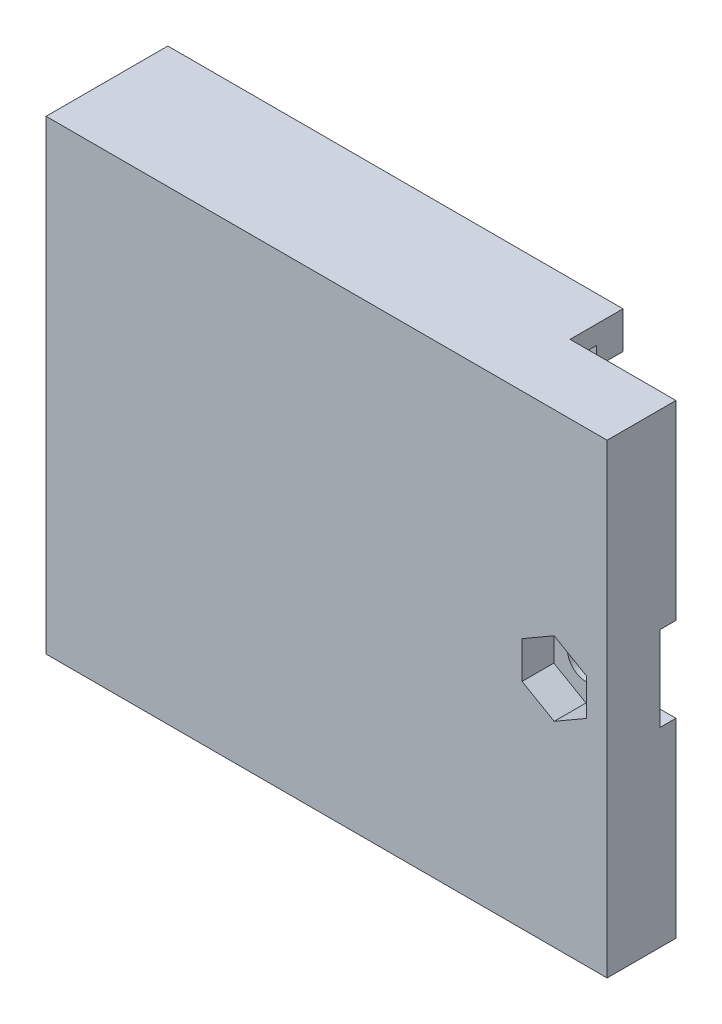
ISO-10303-21;
HEADER;
FILE_DESCRIPTION(('STEP AP214'),'2;1');
FILE_NAME('part.step','',(''),(''),'','','');
FILE_SCHEMA(('AUTOMOTIVE_DESIGN { 1 0 10303 214 1 1 1 1 }'));
ENDSEC;
DATA;
#1=APPLICATION_CONTEXT('core data for automotive mechanical design processes');
#2=APPLICATION_PROTOCOL_DEFINITION('international standard','automotive_design',2000,#1);
#3=PRODUCT_CONTEXT('',#1,'mechanical');
#4=PRODUCT('Part','Part','',(#3));
#5=PRODUCT_RELATED_PRODUCT_CATEGORY('part','',(#4));
#6=PRODUCT_DEFINITION_FORMATION('','',#4);
#7=PRODUCT_DEFINITION_CONTEXT('part definition',#1,'design');
#8=PRODUCT_DEFINITION('design','',#6,#7);
#9=PRODUCT_DEFINITION_SHAPE('','',#8);
#10=(LENGTH_UNIT() NAMED_UNIT(*) SI_UNIT(.MILLI.,.METRE.));
#11=(NAMED_UNIT(*) PLANE_ANGLE_UNIT() SI_UNIT($,.RADIAN.));
#12=(NAMED_UNIT(*) SI_UNIT($,.STERADIAN.) SOLID_ANGLE_UNIT());
#13=UNCERTAINTY_MEASURE_WITH_UNIT(LENGTH_MEASURE(1.E-05),#10,'distance_accuracy_value','');
#14=(GEOMETRIC_REPRESENTATION_CONTEXT(3) GLOBAL_UNCERTAINTY_ASSIGNED_CONTEXT((#13)) GLOBAL_UNIT_ASSIGNED_CONTEXT((#10,
#11,#12)) REPRESENTATION_CONTEXT('',''));
#15=CARTESIAN_POINT('',(0.,0.,0.));
#16=DIRECTION('',(0.,0.,1.));
#17=DIRECTION('',(1.,0.,0.));
#18=AXIS2_PLACEMENT_3D('',#15,#16,#17);
#19=CARTESIAN_POINT('',(21.5,0.,6.5));
#20=DIRECTION('',(0.,0.,-1.));
#21=DIRECTION('',(-1.,0.,0.));
#22=AXIS2_PLACEMENT_3D('',#19,#20,#21);
#23=CYLINDRICAL_SURFACE('',#22,1.75);
#24=CARTESIAN_POINT('',(21.5,0.,1.5));
#25=DIRECTION('',(0.,0.,1.));
#26=DIRECTION('',(1.,0.,0.));
#27=AXIS2_PLACEMENT_3D('',#24,#25,#26);
#28=CIRCLE('',#27,1.75);
#29=CARTESIAN_POINT('',(19.75,0.,1.5));
#30=VERTEX_POINT('',#29);
#31=EDGE_CURVE('E327',#30,#30,#28,.T.);
#32=CARTESIAN_POINT('',(21.5,0.,3.5));
#33=DIRECTION('',(0.,0.,1.));
#34=DIRECTION('',(1.,0.,0.));
#35=AXIS2_PLACEMENT_3D('',#32,#33,#34);
#36=CIRCLE('',#35,1.75);
#37=CARTESIAN_POINT('',(19.75,0.,3.5));
#38=VERTEX_POINT('',#37);
#39=EDGE_CURVE('E37',#38,#38,#36,.T.);
#40=CARTESIAN_POINT('',(19.75,0.,1.5));
#41=CARTESIAN_POINT('',(19.75,0.,1.52083333333333));
#42=CARTESIAN_POINT('',(19.75,0.,1.54166666666667));
#43=CARTESIAN_POINT('',(19.75,0.,1.58333333333333));
#44=CARTESIAN_POINT('',(19.75,0.,1.60416666666667));
#45=CARTESIAN_POINT('',(19.75,0.,1.64583333333333));
#46=CARTESIAN_POINT('',(19.75,0.,1.66666666666667));
#47=CARTESIAN_POINT('',(19.75,0.,1.70833333333333));
#48=CARTESIAN_POINT('',(19.75,0.,1.72916666666667));
#49=CARTESIAN_POINT('',(19.75,0.,1.77083333333333));
#50=CARTESIAN_POINT('',(19.75,0.,1.79166666666667));
#51=CARTESIAN_POINT('',(19.75,0.,1.83333333333333));
#52=CARTESIAN_POINT('',(19.75,0.,1.85416666666667));
#53=CARTESIAN_POINT('',(19.75,0.,1.89583333333333));
#54=CARTESIAN_POINT('',(19.75,0.,1.91666666666667));
#55=CARTESIAN_POINT('',(19.75,0.,1.95833333333333));
#56=CARTESIAN_POINT('',(19.75,0.,1.97916666666667));
#57=CARTESIAN_POINT('',(19.75,0.,2.02083333333333));
#58=CARTESIAN_POINT('',(19.75,0.,2.04166666666667));
#59=CARTESIAN_POINT('',(19.75,0.,2.08333333333333));
#60=CARTESIAN_POINT('',(19.75,0.,2.10416666666667));
#61=CARTESIAN_POINT('',(19.75,0.,2.14583333333333));
#62=CARTESIAN_POINT('',(19.75,0.,2.16666666666667));
#63=CARTESIAN_POINT('',(19.75,0.,2.20833333333333));
#64=CARTESIAN_POINT('',(19.75,0.,2.22916666666667));
#65=CARTESIAN_POINT('',(19.75,0.,2.27083333333333));
#66=CARTESIAN_POINT('',(19.75,0.,2.29166666666667));
#67=CARTESIAN_POINT('',(19.75,0.,2.33333333333333));
#68=CARTESIAN_POINT('',(19.75,0.,2.35416666666667));
#69=CARTESIAN_POINT('',(19.75,0.,2.39583333333333));
#70=CARTESIAN_POINT('',(19.75,0.,2.41666666666667));
#71=CARTESIAN_POINT('',(19.75,0.,2.45833333333333));
#72=CARTESIAN_POINT('',(19.75,0.,2.47916666666667));
#73=CARTESIAN_POINT('',(19.75,0.,2.52083333333333));
#74=CARTESIAN_POINT('',(19.75,0.,2.54166666666667));
#75=CARTESIAN_POINT('',(19.75,0.,2.58333333333333));
#76=CARTESIAN_POINT('',(19.75,0.,2.60416666666667));
#77=CARTESIAN_POINT('',(19.75,0.,2.64583333333333));
#78=CARTESIAN_POINT('',(19.75,0.,2.66666666666667));
#79=CARTESIAN_POINT('',(19.75,0.,2.70833333333333));
#80=CARTESIAN_POINT('',(19.75,0.,2.72916666666667));
#81=CARTESIAN_POINT('',(19.75,0.,2.77083333333333));
#82=CARTESIAN_POINT('',(19.75,0.,2.79166666666667));
#83=CARTESIAN_POINT('',(19.75,0.,2.83333333333333));
#84=CARTESIAN_POINT('',(19.75,0.,2.85416666666667));
#85=CARTESIAN_POINT('',(19.75,0.,2.89583333333333));
#86=CARTESIAN_POINT('',(19.75,0.,2.91666666666667));
#87=CARTESIAN_POINT('',(19.75,0.,2.95833333333333));
#88=CARTESIAN_POINT('',(19.75,0.,2.97916666666667));
#89=CARTESIAN_POINT('',(19.75,0.,3.02083333333333));
#90=CARTESIAN_POINT('',(19.75,0.,3.04166666666667));
#91=CARTESIAN_POINT('',(19.75,0.,3.08333333333333));
#92=CARTESIAN_POINT('',(19.75,0.,3.10416666666667));
#93=CARTESIAN_POINT('',(19.75,0.,3.14583333333333));
#94=CARTESIAN_POINT('',(19.75,0.,3.16666666666667));
#95=CARTESIAN_POINT('',(19.75,0.,3.20833333333333));
#96=CARTESIAN_POINT('',(19.75,0.,3.22916666666667));
#97=CARTESIAN_POINT('',(19.75,0.,3.27083333333333));
#98=CARTESIAN_POINT('',(19.75,0.,3.29166666666667));
#99=CARTESIAN_POINT('',(19.75,0.,3.33333333333333));
#100=CARTESIAN_POINT('',(19.75,0.,3.35416666666667));
#101=CARTESIAN_POINT('',(19.75,0.,3.39583333333333));
#102=CARTESIAN_POINT('',(19.75,0.,3.41666666666667));
#103=CARTESIAN_POINT('',(19.75,0.,3.45833333333333));
#104=CARTESIAN_POINT('',(19.75,0.,3.47916666666667));
#105=CARTESIAN_POINT('',(19.75,0.,3.5));
#106=B_SPLINE_CURVE_WITH_KNOTS('',3,(#40,#41,#42,#43,#44,#45,#46,#47,#48,#49,#50,#51,#52,#53,
#54,#55,#56,#57,#58,#59,#60,#61,#62,#63,#64,#65,#66,#67,#68,#69,#70,#71,#72,#73,#74,#75,#76,#77,
#78,#79,#80,#81,#82,#83,#84,#85,#86,#87,#88,#89,#90,#91,#92,#93,#94,#95,#96,#97,#98,#99,#100,
#101,#102,#103,#104,#105),.UNSPECIFIED.,.F.,.F.,(4,2,2,2,2,2,2,2,2,2,2,2,2,2,2,2,2,2,2,2,2,2,2,
2,2,2,2,2,2,2,2,2,4),(0.,0.0625000000000001,0.125,0.1875,0.25,0.3125,0.375,0.4375,0.5,0.5625,
0.625,0.6875,0.75,0.8125,0.875,0.9375,1.,1.0625,1.125,1.1875,1.25,1.3125,1.375,1.4375,1.5,
1.5625,1.625,1.6875,1.75,1.8125,1.875,1.9375,2.),.UNSPECIFIED.);
#107=EDGE_CURVE('BSEAM33',#30,#38,#106,.T.);
#108=ORIENTED_EDGE('',*,*,#31,.F.);
#109=ORIENTED_EDGE('',*,*,#39,.T.);
#110=ORIENTED_EDGE('',*,*,#107,.T.);
#111=ORIENTED_EDGE('',*,*,#107,.F.);
#112=EDGE_LOOP('',(#108,#110,#109,#111));
#113=FACE_BOUND('',#112,.T.);
#114=ADVANCED_FACE('F33',(#113),#23,.F.);
#115=CARTESIAN_POINT('',(-26.5,-4.,1.5));
#116=DIRECTION('',(0.,-1.,0.));
#117=DIRECTION('',(0.,0.,-1.));
#118=AXIS2_PLACEMENT_3D('',#115,#116,#117);
#119=PLANE('',#118);
#120=DIRECTION('',(0.992277876713668,0.,0.124034734589208));
#121=VECTOR('',#120,1.);
#122=CARTESIAN_POINT('',(-18.5,-4.,1.5));
#123=LINE('',#122,#121);
#124=CARTESIAN_POINT('',(-24.5,-4.,0.75));
#125=VERTEX_POINT('',#124);
#126=CARTESIAN_POINT('',(-18.5,-4.,1.5));
#127=VERTEX_POINT('',#126);
#128=EDGE_CURVE('E58',#125,#127,#123,.T.);
#129=ORIENTED_EDGE('',*,*,#128,.T.);
#130=DIRECTION('',(-1.,0.,0.));
#131=VECTOR('',#130,1.);
#132=CARTESIAN_POINT('',(-26.5,-4.,1.5));
#133=LINE('',#132,#131);
#134=CARTESIAN_POINT('',(26.5,-4.,1.5));
#135=VERTEX_POINT('',#134);
#136=EDGE_CURVE('E311',#135,#127,#133,.T.);
#137=ORIENTED_EDGE('',*,*,#136,.F.);
#138=DIRECTION('',(0.,0.,-1.));
#139=VECTOR('',#138,1.);
#140=CARTESIAN_POINT('',(26.5,-4.,1.5));
#141=LINE('',#140,#139);
#142=CARTESIAN_POINT('',(26.5,-4.,0.));
#143=VERTEX_POINT('',#142);
#144=EDGE_CURVE('E325',#135,#143,#141,.T.);
#145=ORIENTED_EDGE('',*,*,#144,.T.);
#146=DIRECTION('',(-1.,0.,0.));
#147=VECTOR('',#146,1.);
#148=CARTESIAN_POINT('',(-26.5,-4.,0.));
#149=LINE('',#148,#147);
#150=CARTESIAN_POINT('',(-24.5,-4.,0.));
#151=VERTEX_POINT('',#150);
#152=EDGE_CURVE('E310',#143,#151,#149,.T.);
#153=ORIENTED_EDGE('',*,*,#152,.T.);
#154=DIRECTION('',(0.,0.,1.));
#155=VECTOR('',#154,1.);
#156=CARTESIAN_POINT('',(-24.5,-4.,-1.5));
#157=LINE('',#156,#155);
#158=EDGE_CURVE('E293',#151,#125,#157,.T.);
#159=ORIENTED_EDGE('',*,*,#158,.T.);
#160=EDGE_LOOP('',(#129,#137,#145,#153,#159));
#161=FACE_BOUND('',#160,.T.);
#162=ADVANCED_FACE('F447',(#161),#119,.F.);
#163=CARTESIAN_POINT('',(26.5,4.,1.5));
#164=DIRECTION('',(0.,1.,0.));
#165=DIRECTION('',(0.,0.,1.));
#166=AXIS2_PLACEMENT_3D('',#163,#164,#165);
#167=PLANE('',#166);
#168=DIRECTION('',(0.992277876713668,0.,0.124034734589208));
#169=VECTOR('',#168,1.);
#170=CARTESIAN_POINT('',(-18.5,4.,1.5));
#171=LINE('',#170,#169);
#172=CARTESIAN_POINT('',(-24.5,4.,0.75));
#173=VERTEX_POINT('',#172);
#174=CARTESIAN_POINT('',(-18.5,4.,1.5));
#175=VERTEX_POINT('',#174);
#176=EDGE_CURVE('E275',#173,#175,#171,.T.);
#177=ORIENTED_EDGE('',*,*,#176,.F.);
#178=DIRECTION('',(0.,0.,1.));
#179=VECTOR('',#178,1.);
#180=CARTESIAN_POINT('',(-24.5,4.,-1.5));
#181=LINE('',#180,#179);
#182=CARTESIAN_POINT('',(-24.5,4.,0.));
#183=VERTEX_POINT('',#182);
#184=EDGE_CURVE('E297',#183,#173,#181,.T.);
#185=ORIENTED_EDGE('',*,*,#184,.F.);
#186=DIRECTION('',(1.,0.,0.));
#187=VECTOR('',#186,1.);
#188=CARTESIAN_POINT('',(26.5,4.,0.));
#189=LINE('',#188,#187);
#190=CARTESIAN_POINT('',(26.5,4.,0.));
#191=VERTEX_POINT('',#190);
#192=EDGE_CURVE('E322',#183,#191,#189,.T.);
#193=ORIENTED_EDGE('',*,*,#192,.T.);
#194=DIRECTION('',(0.,0.,-1.));
#195=VECTOR('',#194,1.);
#196=CARTESIAN_POINT('',(26.5,4.,1.5));
#197=LINE('',#196,#195);
#198=CARTESIAN_POINT('',(26.5,4.,1.5));
#199=VERTEX_POINT('',#198);
#200=EDGE_CURVE('E319',#199,#191,#197,.T.);
#201=ORIENTED_EDGE('',*,*,#200,.F.);
#202=DIRECTION('',(1.,0.,0.));
#203=VECTOR('',#202,1.);
#204=CARTESIAN_POINT('',(26.5,4.,1.5));
#205=LINE('',#204,#203);
#206=EDGE_CURVE('E313',#175,#199,#205,.T.);
#207=ORIENTED_EDGE('',*,*,#206,.F.);
#208=EDGE_LOOP('',(#177,#185,#193,#201,#207));
#209=FACE_BOUND('',#208,.T.);
#210=ADVANCED_FACE('F501',(#209),#167,.F.);
#211=CARTESIAN_POINT('',(0.,0.,1.5));
#212=DIRECTION('',(0.,0.,1.));
#213=DIRECTION('',(1.,0.,0.));
#214=AXIS2_PLACEMENT_3D('',#211,#212,#213);
#215=PLANE('',#214);
#216=ORIENTED_EDGE('',*,*,#31,.T.);
#217=EDGE_LOOP('',(#216));
#218=FACE_BOUND('',#217,.T.);
#219=DIRECTION('',(0.,1.,0.));
#220=VECTOR('',#219,1.);
#221=CARTESIAN_POINT('',(-18.5,-10.0466933112239,1.5));
#222=LINE('',#221,#220);
#223=EDGE_CURVE('E278',#127,#175,#222,.T.);
#224=ORIENTED_EDGE('',*,*,#223,.T.);
#225=ORIENTED_EDGE('',*,*,#206,.T.);
#226=DIRECTION('',(0.,-1.,0.));
#227=VECTOR('',#226,1.);
#228=CARTESIAN_POINT('',(26.5,-4.,1.5));
#229=LINE('',#228,#227);
#230=EDGE_CURVE('E316',#199,#135,#229,.T.);
#231=ORIENTED_EDGE('',*,*,#230,.T.);
#232=ORIENTED_EDGE('',*,*,#136,.T.);
#233=EDGE_LOOP('',(#224,#225,#231,#232));
#234=FACE_BOUND('',#233,.T.);
#235=ADVANCED_FACE('F442',(#218,#234),#215,.F.);
#236=CARTESIAN_POINT('',(-24.5,4.,-1.5));
#237=DIRECTION('',(-1.,0.,0.));
#238=DIRECTION('',(0.,-1.,0.));
#239=AXIS2_PLACEMENT_3D('',#236,#237,#238);
#240=PLANE('',#239);
#241=DIRECTION('',(0.,1.,0.));
#242=VECTOR('',#241,1.);
#243=CARTESIAN_POINT('',(-24.5,-10.0466933112239,0.75));
#244=LINE('',#243,#242);
#245=EDGE_CURVE('E279',#125,#173,#244,.T.);
#246=ORIENTED_EDGE('',*,*,#245,.F.);
#247=ORIENTED_EDGE('',*,*,#158,.F.);
#248=CARTESIAN_POINT('',(-24.5,-4.,-1.5));
#249=VERTEX_POINT('',#248);
#250=EDGE_CURVE('E294',#249,#151,#157,.T.);
#251=ORIENTED_EDGE('',*,*,#250,.F.);
#252=DIRECTION('',(0.,-1.,0.));
#253=VECTOR('',#252,1.);
#254=CARTESIAN_POINT('',(-24.5,4.,-1.5));
#255=LINE('',#254,#253);
#256=CARTESIAN_POINT('',(-24.5,4.,-1.5));
#257=VERTEX_POINT('',#256);
#258=EDGE_CURVE('E291',#257,#249,#255,.T.);
#259=ORIENTED_EDGE('',*,*,#258,.F.);
#260=EDGE_CURVE('E298',#257,#183,#181,.T.);
#261=ORIENTED_EDGE('',*,*,#260,.T.);
#262=ORIENTED_EDGE('',*,*,#184,.T.);
#263=EDGE_LOOP('',(#246,#247,#251,#259,#261,#262));
#264=FACE_BOUND('',#263,.T.);
#265=ADVANCED_FACE('F486',(#264),#240,.F.);
#266=CARTESIAN_POINT('',(0.,0.,0.));
#267=DIRECTION('',(0.,0.,1.));
#268=DIRECTION('',(1.,0.,0.));
#269=AXIS2_PLACEMENT_3D('',#266,#267,#268);
#270=PLANE('',#269);
#271=DIRECTION('',(0.,-1.,0.));
#272=VECTOR('',#271,1.);
#273=CARTESIAN_POINT('',(-26.5,22.,0.));
#274=LINE('',#273,#272);
#275=CARTESIAN_POINT('',(-26.5,-4.,0.));
#276=VERTEX_POINT('',#275);
#277=CARTESIAN_POINT('',(-26.5,-20.25,0.));
#278=VERTEX_POINT('',#277);
#279=EDGE_CURVE('E430',#276,#278,#274,.T.);
#280=ORIENTED_EDGE('',*,*,#279,.F.);
#281=DIRECTION('',(-1.,0.,0.));
#282=VECTOR('',#281,1.);
#283=CARTESIAN_POINT('',(0.,-4.,0.));
#284=LINE('',#283,#282);
#285=EDGE_CURVE('E307',#151,#276,#284,.T.);
#286=ORIENTED_EDGE('',*,*,#285,.F.);
#287=ORIENTED_EDGE('',*,*,#152,.F.);
#288=DIRECTION('',(0.,1.,0.));
#289=VECTOR('',#288,1.);
#290=CARTESIAN_POINT('',(26.5,22.,0.));
#291=LINE('',#290,#289);
#292=CARTESIAN_POINT('',(26.5,-22.,0.));
#293=VERTEX_POINT('',#292);
#294=EDGE_CURVE('E424',#293,#143,#291,.T.);
#295=ORIENTED_EDGE('',*,*,#294,.F.);
#296=DIRECTION('',(1.,0.,0.));
#297=VECTOR('',#296,1.);
#298=CARTESIAN_POINT('',(-26.5,-22.,0.));
#299=LINE('',#298,#297);
#300=CARTESIAN_POINT('',(16.5,-22.,0.));
#301=VERTEX_POINT('',#300);
#302=EDGE_CURVE('E417',#301,#293,#299,.T.);
#303=ORIENTED_EDGE('',*,*,#302,.F.);
#304=DIRECTION('',(0.,-1.,0.));
#305=VECTOR('',#304,1.);
#306=CARTESIAN_POINT('',(16.5,-22.,0.));
#307=LINE('',#306,#305);
#308=CARTESIAN_POINT('',(16.5,-20.25,0.));
#309=VERTEX_POINT('',#308);
#310=EDGE_CURVE('E396',#309,#301,#307,.T.);
#311=ORIENTED_EDGE('',*,*,#310,.F.);
#312=DIRECTION('',(1.,0.,0.));
#313=VECTOR('',#312,1.);
#314=CARTESIAN_POINT('',(16.5,-20.25,0.));
#315=LINE('',#314,#313);
#316=EDGE_CURVE('E391',#278,#309,#315,.T.);
#317=ORIENTED_EDGE('',*,*,#316,.F.);
#318=EDGE_LOOP('',(#280,#286,#287,#295,#303,#311,#317));
#319=FACE_BOUND('',#318,.T.);
#320=ADVANCED_FACE('F489',(#319),#270,.F.);
#321=CARTESIAN_POINT('',(16.5,20.25,-5.));
#322=DIRECTION('',(0.,1.,0.));
#323=DIRECTION('',(0.,0.,1.));
#324=AXIS2_PLACEMENT_3D('',#321,#322,#323);
#325=PLANE('',#324);
#326=DIRECTION('',(1.,0.,0.));
#327=VECTOR('',#326,1.);
#328=CARTESIAN_POINT('',(-26.5,20.25,-2.5));
#329=LINE('',#328,#327);
#330=CARTESIAN_POINT('',(-26.5,20.25,-2.5));
#331=VERTEX_POINT('',#330);
#332=CARTESIAN_POINT('',(16.5,20.25,-2.5));
#333=VERTEX_POINT('',#332);
#334=EDGE_CURVE('E330',#331,#333,#329,.T.);
#335=ORIENTED_EDGE('',*,*,#334,.T.);
#336=DIRECTION('',(0.,0.,1.));
#337=VECTOR('',#336,1.);
#338=CARTESIAN_POINT('',(16.5,20.25,-5.));
#339=LINE('',#338,#337);
#340=CARTESIAN_POINT('',(16.5,20.25,0.));
#341=VERTEX_POINT('',#340);
#342=EDGE_CURVE('E387',#333,#341,#339,.T.);
#343=ORIENTED_EDGE('',*,*,#342,.T.);
#344=DIRECTION('',(-1.,0.,0.));
#345=VECTOR('',#344,1.);
#346=CARTESIAN_POINT('',(16.5,20.25,0.));
#347=LINE('',#346,#345);
#348=CARTESIAN_POINT('',(-26.5,20.25,0.));
#349=VERTEX_POINT('',#348);
#350=EDGE_CURVE('E377',#341,#349,#347,.T.);
#351=ORIENTED_EDGE('',*,*,#350,.T.);
#352=DIRECTION('',(0.,0.,1.));
#353=VECTOR('',#352,1.);
#354=CARTESIAN_POINT('',(-26.5,20.25,-5.));
#355=LINE('',#354,#353);
#356=EDGE_CURVE('E381',#331,#349,#355,.T.);
#357=ORIENTED_EDGE('',*,*,#356,.F.);
#358=EDGE_LOOP('',(#335,#343,#351,#357));
#359=FACE_BOUND('',#358,.T.);
#360=ADVANCED_FACE('F527',(#359),#325,.F.);
#361=CARTESIAN_POINT('',(16.5,-20.25,-5.));
#362=DIRECTION('',(0.,-1.,0.));
#363=DIRECTION('',(0.,0.,-1.));
#364=AXIS2_PLACEMENT_3D('',#361,#362,#363);
#365=PLANE('',#364);
#366=DIRECTION('',(-1.,0.,0.));
#367=VECTOR('',#366,1.);
#368=CARTESIAN_POINT('',(16.5,-20.25,-2.5));
#369=LINE('',#368,#367);
#370=CARTESIAN_POINT('',(16.5,-20.25,-2.5));
#371=VERTEX_POINT('',#370);
#372=CARTESIAN_POINT('',(-26.5,-20.25,-2.5));
#373=VERTEX_POINT('',#372);
#374=EDGE_CURVE('E355',#371,#373,#369,.T.);
#375=ORIENTED_EDGE('',*,*,#374,.T.);
#376=DIRECTION('',(0.,0.,1.));
#377=VECTOR('',#376,1.);
#378=CARTESIAN_POINT('',(-26.5,-20.25,-5.));
#379=LINE('',#378,#377);
#380=EDGE_CURVE('E409',#373,#278,#379,.T.);
#381=ORIENTED_EDGE('',*,*,#380,.T.);
#382=ORIENTED_EDGE('',*,*,#316,.T.);
#383=DIRECTION('',(0.,0.,1.));
#384=VECTOR('',#383,1.);
#385=CARTESIAN_POINT('',(16.5,-20.25,-5.));
#386=LINE('',#385,#384);
#387=EDGE_CURVE('E407',#371,#309,#386,.T.);
#388=ORIENTED_EDGE('',*,*,#387,.F.);
#389=EDGE_LOOP('',(#375,#381,#382,#388));
#390=FACE_BOUND('',#389,.T.);
#391=ADVANCED_FACE('F530',(#390),#365,.F.);
#392=CARTESIAN_POINT('',(26.5,22.,0.));
#393=VERTEX_POINT('',#392);
#394=EDGE_CURVE('E412',#191,#393,#291,.T.);
#395=ORIENTED_EDGE('',*,*,#394,.F.);
#396=ORIENTED_EDGE('',*,*,#192,.F.);
#397=CARTESIAN_POINT('',(-26.5,4.,0.));
#398=VERTEX_POINT('',#397);
#399=EDGE_CURVE('E314',#398,#183,#189,.T.);
#400=ORIENTED_EDGE('',*,*,#399,.F.);
#401=EDGE_CURVE('E431',#349,#398,#274,.T.);
#402=ORIENTED_EDGE('',*,*,#401,.F.);
#403=ORIENTED_EDGE('',*,*,#350,.F.);
#404=DIRECTION('',(0.,-1.,0.));
#405=VECTOR('',#404,1.);
#406=CARTESIAN_POINT('',(16.5,22.,0.));
#407=LINE('',#406,#405);
#408=CARTESIAN_POINT('',(16.5,22.,0.));
#409=VERTEX_POINT('',#408);
#410=EDGE_CURVE('E370',#409,#341,#407,.T.);
#411=ORIENTED_EDGE('',*,*,#410,.F.);
#412=DIRECTION('',(-1.,0.,0.));
#413=VECTOR('',#412,1.);
#414=CARTESIAN_POINT('',(-26.5,22.,0.));
#415=LINE('',#414,#413);
#416=EDGE_CURVE('E427',#393,#409,#415,.T.);
#417=ORIENTED_EDGE('',*,*,#416,.F.);
#418=EDGE_LOOP('',(#395,#396,#400,#402,#403,#411,#417));
#419=FACE_BOUND('',#418,.T.);
#420=ADVANCED_FACE('F545',(#419),#270,.F.);
#421=CARTESIAN_POINT('',(0.,0.,6.5));
#422=DIRECTION('',(0.,0.,1.));
#423=DIRECTION('',(1.,0.,0.));
#424=AXIS2_PLACEMENT_3D('',#421,#422,#423);
#425=PLANE('',#424);
#426=DIRECTION('',(0.866025403784439,-0.5,0.));
#427=VECTOR('',#426,1.);
#428=CARTESIAN_POINT('',(18.4689110867545,-1.75,6.5));
#429=LINE('',#428,#427);
#430=CARTESIAN_POINT('',(18.4689110867545,-1.75,6.5));
#431=VERTEX_POINT('',#430);
#432=CARTESIAN_POINT('',(21.5,-3.5,6.5));
#433=VERTEX_POINT('',#432);
#434=EDGE_CURVE('E50',#431,#433,#429,.T.);
#435=ORIENTED_EDGE('',*,*,#434,.F.);
#436=DIRECTION('',(0.,-1.,0.));
#437=VECTOR('',#436,1.);
#438=CARTESIAN_POINT('',(18.4689110867545,1.75,6.5));
#439=LINE('',#438,#437);
#440=CARTESIAN_POINT('',(18.4689110867545,1.75,6.5));
#441=VERTEX_POINT('',#440);
#442=EDGE_CURVE('E242',#441,#431,#439,.T.);
#443=ORIENTED_EDGE('',*,*,#442,.F.);
#444=DIRECTION('',(-0.866025403784439,-0.5,0.));
#445=VECTOR('',#444,1.);
#446=CARTESIAN_POINT('',(21.5,3.5,6.5));
#447=LINE('',#446,#445);
#448=CARTESIAN_POINT('',(21.5,3.5,6.5));
#449=VERTEX_POINT('',#448);
#450=EDGE_CURVE('E245',#449,#441,#447,.T.);
#451=ORIENTED_EDGE('',*,*,#450,.F.);
#452=DIRECTION('',(-0.866025403784439,0.5,0.));
#453=VECTOR('',#452,1.);
#454=CARTESIAN_POINT('',(24.5310889132455,1.75000000000001,6.5));
#455=LINE('',#454,#453);
#456=CARTESIAN_POINT('',(24.5310889132455,1.75000000000001,6.5));
#457=VERTEX_POINT('',#456);
#458=EDGE_CURVE('E261',#457,#449,#455,.T.);
#459=ORIENTED_EDGE('',*,*,#458,.F.);
#460=DIRECTION('',(0.,1.,0.));
#461=VECTOR('',#460,1.);
#462=CARTESIAN_POINT('',(24.5310889132455,-1.75,6.5));
#463=LINE('',#462,#461);
#464=CARTESIAN_POINT('',(24.5310889132455,-1.75,6.5));
#465=VERTEX_POINT('',#464);
#466=EDGE_CURVE('E258',#465,#457,#463,.T.);
#467=ORIENTED_EDGE('',*,*,#466,.F.);
#468=DIRECTION('',(0.866025403784438,0.5,0.));
#469=VECTOR('',#468,1.);
#470=CARTESIAN_POINT('',(21.5,-3.5,6.5));
#471=LINE('',#470,#469);
#472=EDGE_CURVE('E256',#433,#465,#471,.T.);
#473=ORIENTED_EDGE('',*,*,#472,.F.);
#474=EDGE_LOOP('',(#435,#443,#451,#459,#467,#473));
#475=FACE_BOUND('',#474,.T.);
#476=DIRECTION('',(0.,1.,0.));
#477=VECTOR('',#476,1.);
#478=CARTESIAN_POINT('',(26.5,22.,6.5));
#479=LINE('',#478,#477);
#480=CARTESIAN_POINT('',(26.5,-22.,6.5));
#481=VERTEX_POINT('',#480);
#482=CARTESIAN_POINT('',(26.5,22.,6.5));
#483=VERTEX_POINT('',#482);
#484=EDGE_CURVE('E413',#481,#483,#479,.T.);
#485=ORIENTED_EDGE('',*,*,#484,.T.);
#486=DIRECTION('',(-1.,0.,0.));
#487=VECTOR('',#486,1.);
#488=CARTESIAN_POINT('',(-26.5,22.,6.5));
#489=LINE('',#488,#487);
#490=CARTESIAN_POINT('',(-26.5,22.,6.5));
#491=VERTEX_POINT('',#490);
#492=EDGE_CURVE('E416',#483,#491,#489,.T.);
#493=ORIENTED_EDGE('',*,*,#492,.T.);
#494=DIRECTION('',(0.,-1.,0.));
#495=VECTOR('',#494,1.);
#496=CARTESIAN_POINT('',(-26.5,22.,6.5));
#497=LINE('',#496,#495);
#498=CARTESIAN_POINT('',(-26.5,-22.,6.5));
#499=VERTEX_POINT('',#498);
#500=EDGE_CURVE('E419',#491,#499,#497,.T.);
#501=ORIENTED_EDGE('',*,*,#500,.T.);
#502=DIRECTION('',(1.,0.,0.));
#503=VECTOR('',#502,1.);
#504=CARTESIAN_POINT('',(-26.5,-22.,6.5));
#505=LINE('',#504,#503);
#506=EDGE_CURVE('E421',#499,#481,#505,.T.);
#507=ORIENTED_EDGE('',*,*,#506,.T.);
#508=EDGE_LOOP('',(#485,#493,#501,#507));
#509=FACE_BOUND('',#508,.T.);
#510=ADVANCED_FACE('F548',(#475,#509),#425,.T.);
#511=CARTESIAN_POINT('',(26.5,22.,6.5));
#512=DIRECTION('',(-1.,0.,0.));
#513=DIRECTION('',(0.,-1.,0.));
#514=AXIS2_PLACEMENT_3D('',#511,#512,#513);
#515=PLANE('',#514);
#516=ORIENTED_EDGE('',*,*,#294,.T.);
#517=ORIENTED_EDGE('',*,*,#144,.F.);
#518=ORIENTED_EDGE('',*,*,#230,.F.);
#519=ORIENTED_EDGE('',*,*,#200,.T.);
#520=ORIENTED_EDGE('',*,*,#394,.T.);
#521=DIRECTION('',(0.,0.,-1.));
#522=VECTOR('',#521,1.);
#523=CARTESIAN_POINT('',(26.5,22.,6.5));
#524=LINE('',#523,#522);
#525=EDGE_CURVE('E11',#483,#393,#524,.T.);
#526=ORIENTED_EDGE('',*,*,#525,.F.);
#527=ORIENTED_EDGE('',*,*,#484,.F.);
#528=DIRECTION('',(0.,0.,-1.));
#529=VECTOR('',#528,1.);
#530=CARTESIAN_POINT('',(26.5,-22.,6.5));
#531=LINE('',#530,#529);
#532=EDGE_CURVE('E423',#481,#293,#531,.T.);
#533=ORIENTED_EDGE('',*,*,#532,.T.);
#534=EDGE_LOOP('',(#516,#517,#518,#519,#520,#526,#527,#533));
#535=FACE_BOUND('',#534,.T.);
#536=ADVANCED_FACE('F35',(#535),#515,.F.);
#537=CARTESIAN_POINT('',(-26.5,22.,6.5));
#538=DIRECTION('',(0.,-1.,0.));
#539=DIRECTION('',(0.,0.,-1.));
#540=AXIS2_PLACEMENT_3D('',#537,#538,#539);
#541=PLANE('',#540);
#542=ORIENTED_EDGE('',*,*,#416,.T.);
#543=DIRECTION('',(0.,0.,1.));
#544=VECTOR('',#543,1.);
#545=CARTESIAN_POINT('',(16.5,22.,-5.));
#546=LINE('',#545,#544);
#547=CARTESIAN_POINT('',(16.5,22.,-5.));
#548=VERTEX_POINT('',#547);
#549=EDGE_CURVE('E389',#548,#409,#546,.T.);
#550=ORIENTED_EDGE('',*,*,#549,.F.);
#551=DIRECTION('',(1.,0.,0.));
#552=VECTOR('',#551,1.);
#553=CARTESIAN_POINT('',(-26.5,22.,-5.));
#554=LINE('',#553,#552);
#555=CARTESIAN_POINT('',(-26.5,22.,-5.));
#556=VERTEX_POINT('',#555);
#557=EDGE_CURVE('E376',#556,#548,#554,.T.);
#558=ORIENTED_EDGE('',*,*,#557,.F.);
#559=DIRECTION('',(0.,0.,-1.));
#560=VECTOR('',#559,1.);
#561=CARTESIAN_POINT('',(-26.5,22.,6.5));
#562=LINE('',#561,#560);
#563=EDGE_CURVE('E42',#491,#556,#562,.T.);
#564=ORIENTED_EDGE('',*,*,#563,.F.);
#565=ORIENTED_EDGE('',*,*,#492,.F.);
#566=ORIENTED_EDGE('',*,*,#525,.T.);
#567=EDGE_LOOP('',(#542,#550,#558,#564,#565,#566));
#568=FACE_BOUND('',#567,.T.);
#569=ADVANCED_FACE('F560',(#568),#541,.F.);
#570=CARTESIAN_POINT('',(-26.5,22.,6.5));
#571=DIRECTION('',(1.,0.,0.));
#572=DIRECTION('',(0.,1.,0.));
#573=AXIS2_PLACEMENT_3D('',#570,#571,#572);
#574=PLANE('',#573);
#575=DIRECTION('',(0.,0.,1.));
#576=VECTOR('',#575,1.);
#577=CARTESIAN_POINT('',(-26.5,-4.,-1.5));
#578=LINE('',#577,#576);
#579=CARTESIAN_POINT('',(-26.5,-4.,-1.5));
#580=VERTEX_POINT('',#579);
#581=EDGE_CURVE('E304',#580,#276,#578,.T.);
#582=ORIENTED_EDGE('',*,*,#581,.T.);
#583=ORIENTED_EDGE('',*,*,#279,.T.);
#584=ORIENTED_EDGE('',*,*,#380,.F.);
#585=DIRECTION('',(0.,1.,0.));
#586=VECTOR('',#585,1.);
#587=CARTESIAN_POINT('',(-26.5,-20.25,-2.5));
#588=LINE('',#587,#586);
#589=CARTESIAN_POINT('',(-26.5,-18.5,-2.5));
#590=VERTEX_POINT('',#589);
#591=EDGE_CURVE('E358',#373,#590,#588,.T.);
#592=ORIENTED_EDGE('',*,*,#591,.T.);
#593=DIRECTION('',(0.,0.,-1.));
#594=VECTOR('',#593,1.);
#595=CARTESIAN_POINT('',(-26.5,-18.5,-2.5));
#596=LINE('',#595,#594);
#597=CARTESIAN_POINT('',(-26.5,-18.5,-5.));
#598=VERTEX_POINT('',#597);
#599=EDGE_CURVE('E364',#590,#598,#596,.T.);
#600=ORIENTED_EDGE('',*,*,#599,.T.);
#601=DIRECTION('',(0.,1.,0.));
#602=VECTOR('',#601,1.);
#603=CARTESIAN_POINT('',(-26.5,-20.25,-5.));
#604=LINE('',#603,#602);
#605=CARTESIAN_POINT('',(-26.5,-22.,-5.));
#606=VERTEX_POINT('',#605);
#607=EDGE_CURVE('E395',#606,#598,#604,.T.);
#608=ORIENTED_EDGE('',*,*,#607,.F.);
#609=DIRECTION('',(0.,0.,-1.));
#610=VECTOR('',#609,1.);
#611=CARTESIAN_POINT('',(-26.5,-22.,6.5));
#612=LINE('',#611,#610);
#613=EDGE_CURVE('E437',#499,#606,#612,.T.);
#614=ORIENTED_EDGE('',*,*,#613,.F.);
#615=ORIENTED_EDGE('',*,*,#500,.F.);
#616=ORIENTED_EDGE('',*,*,#563,.T.);
#617=DIRECTION('',(0.,1.,0.));
#618=VECTOR('',#617,1.);
#619=CARTESIAN_POINT('',(-26.5,20.25,-5.));
#620=LINE('',#619,#618);
#621=CARTESIAN_POINT('',(-26.5,18.5,-5.));
#622=VERTEX_POINT('',#621);
#623=EDGE_CURVE('E373',#622,#556,#620,.T.);
#624=ORIENTED_EDGE('',*,*,#623,.F.);
#625=DIRECTION('',(0.,0.,-1.));
#626=VECTOR('',#625,1.);
#627=CARTESIAN_POINT('',(-26.5,18.5,-2.5));
#628=LINE('',#627,#626);
#629=CARTESIAN_POINT('',(-26.5,18.5,-2.5));
#630=VERTEX_POINT('',#629);
#631=EDGE_CURVE('E346',#630,#622,#628,.T.);
#632=ORIENTED_EDGE('',*,*,#631,.F.);
#633=DIRECTION('',(0.,1.,0.));
#634=VECTOR('',#633,1.);
#635=CARTESIAN_POINT('',(-26.5,18.5,-2.5));
#636=LINE('',#635,#634);
#637=EDGE_CURVE('E340',#630,#331,#636,.T.);
#638=ORIENTED_EDGE('',*,*,#637,.T.);
#639=ORIENTED_EDGE('',*,*,#356,.T.);
#640=ORIENTED_EDGE('',*,*,#401,.T.);
#641=DIRECTION('',(0.,0.,1.));
#642=VECTOR('',#641,1.);
#643=CARTESIAN_POINT('',(-26.5,4.,-1.5));
#644=LINE('',#643,#642);
#645=CARTESIAN_POINT('',(-26.5,4.,-1.5));
#646=VERTEX_POINT('',#645);
#647=EDGE_CURVE('E301',#646,#398,#644,.T.);
#648=ORIENTED_EDGE('',*,*,#647,.F.);
#649=DIRECTION('',(0.,1.,0.));
#650=VECTOR('',#649,1.);
#651=CARTESIAN_POINT('',(-26.5,-4.,-1.5));
#652=LINE('',#651,#650);
#653=EDGE_CURVE('E287',#580,#646,#652,.T.);
#654=ORIENTED_EDGE('',*,*,#653,.F.);
#655=EDGE_LOOP('',(#582,#583,#584,#592,#600,#608,#614,#615,#616,#624,#632,#638,#639,#640,#648,#654));
#656=FACE_BOUND('',#655,.T.);
#657=ADVANCED_FACE('F557',(#656),#574,.F.);
#658=CARTESIAN_POINT('',(-26.5,-22.,6.5));
#659=DIRECTION('',(0.,1.,0.));
#660=DIRECTION('',(0.,0.,1.));
#661=AXIS2_PLACEMENT_3D('',#658,#659,#660);
#662=PLANE('',#661);
#663=ORIENTED_EDGE('',*,*,#613,.T.);
#664=DIRECTION('',(-1.,0.,0.));
#665=VECTOR('',#664,1.);
#666=CARTESIAN_POINT('',(-26.5,-22.,-5.));
#667=LINE('',#666,#665);
#668=CARTESIAN_POINT('',(16.5,-22.,-5.));
#669=VERTEX_POINT('',#668);
#670=EDGE_CURVE('E392',#669,#606,#667,.T.);
#671=ORIENTED_EDGE('',*,*,#670,.F.);
#672=DIRECTION('',(0.,0.,1.));
#673=VECTOR('',#672,1.);
#674=CARTESIAN_POINT('',(16.5,-22.,-5.));
#675=LINE('',#674,#673);
#676=EDGE_CURVE('E400',#669,#301,#675,.T.);
#677=ORIENTED_EDGE('',*,*,#676,.T.);
#678=ORIENTED_EDGE('',*,*,#302,.T.);
#679=ORIENTED_EDGE('',*,*,#532,.F.);
#680=ORIENTED_EDGE('',*,*,#506,.F.);
#681=EDGE_LOOP('',(#663,#671,#677,#678,#679,#680));
#682=FACE_BOUND('',#681,.T.);
#683=ADVANCED_FACE('F542',(#682),#662,.F.);
#684=CARTESIAN_POINT('',(16.5,-22.,-5.));
#685=DIRECTION('',(-1.,0.,0.));
#686=DIRECTION('',(0.,0.,1.));
#687=AXIS2_PLACEMENT_3D('',#684,#685,#686);
#688=PLANE('',#687);
#689=ORIENTED_EDGE('',*,*,#310,.T.);
#690=ORIENTED_EDGE('',*,*,#676,.F.);
#691=DIRECTION('',(0.,-1.,0.));
#692=VECTOR('',#691,1.);
#693=CARTESIAN_POINT('',(16.5,-22.,-5.));
#694=LINE('',#693,#692);
#695=CARTESIAN_POINT('',(16.5,-18.5,-5.));
#696=VERTEX_POINT('',#695);
#697=EDGE_CURVE('E398',#696,#669,#694,.T.);
#698=ORIENTED_EDGE('',*,*,#697,.F.);
#699=DIRECTION('',(0.,0.,-1.));
#700=VECTOR('',#699,1.);
#701=CARTESIAN_POINT('',(16.5,-18.5,-2.5));
#702=LINE('',#701,#700);
#703=CARTESIAN_POINT('',(16.5,-18.5,-2.5));
#704=VERTEX_POINT('',#703);
#705=EDGE_CURVE('E367',#704,#696,#702,.T.);
#706=ORIENTED_EDGE('',*,*,#705,.F.);
#707=DIRECTION('',(0.,-1.,0.));
#708=VECTOR('',#707,1.);
#709=CARTESIAN_POINT('',(16.5,-18.5,-2.5));
#710=LINE('',#709,#708);
#711=EDGE_CURVE('E352',#704,#371,#710,.T.);
#712=ORIENTED_EDGE('',*,*,#711,.T.);
#713=ORIENTED_EDGE('',*,*,#387,.T.);
#714=EDGE_LOOP('',(#689,#690,#698,#706,#712,#713));
#715=FACE_BOUND('',#714,.T.);
#716=ADVANCED_FACE('F538',(#715),#688,.F.);
#717=CARTESIAN_POINT('',(0.,0.,-5.));
#718=DIRECTION('',(0.,0.,1.));
#719=DIRECTION('',(1.,0.,0.));
#720=AXIS2_PLACEMENT_3D('',#717,#718,#719);
#721=PLANE('',#720);
#722=ORIENTED_EDGE('',*,*,#670,.T.);
#723=ORIENTED_EDGE('',*,*,#607,.T.);
#724=DIRECTION('',(1.,0.,0.));
#725=VECTOR('',#724,1.);
#726=CARTESIAN_POINT('',(-26.5,-18.5,-5.));
#727=LINE('',#726,#725);
#728=EDGE_CURVE('E349',#598,#696,#727,.T.);
#729=ORIENTED_EDGE('',*,*,#728,.T.);
#730=ORIENTED_EDGE('',*,*,#697,.T.);
#731=EDGE_LOOP('',(#722,#723,#729,#730));
#732=FACE_BOUND('',#731,.T.);
#733=ADVANCED_FACE('F534',(#732),#721,.F.);
#734=CARTESIAN_POINT('',(16.5,22.,-5.));
#735=DIRECTION('',(-1.,0.,0.));
#736=DIRECTION('',(0.,0.,1.));
#737=AXIS2_PLACEMENT_3D('',#734,#735,#736);
#738=PLANE('',#737);
#739=ORIENTED_EDGE('',*,*,#410,.T.);
#740=ORIENTED_EDGE('',*,*,#342,.F.);
#741=DIRECTION('',(0.,-1.,0.));
#742=VECTOR('',#741,1.);
#743=CARTESIAN_POINT('',(16.5,20.25,-2.5));
#744=LINE('',#743,#742);
#745=CARTESIAN_POINT('',(16.5,18.5,-2.5));
#746=VERTEX_POINT('',#745);
#747=EDGE_CURVE('E333',#333,#746,#744,.T.);
#748=ORIENTED_EDGE('',*,*,#747,.T.);
#749=DIRECTION('',(0.,0.,-1.));
#750=VECTOR('',#749,1.);
#751=CARTESIAN_POINT('',(16.5,18.5,-2.5));
#752=LINE('',#751,#750);
#753=CARTESIAN_POINT('',(16.5,18.5,-5.));
#754=VERTEX_POINT('',#753);
#755=EDGE_CURVE('E343',#746,#754,#752,.T.);
#756=ORIENTED_EDGE('',*,*,#755,.T.);
#757=DIRECTION('',(0.,-1.,0.));
#758=VECTOR('',#757,1.);
#759=CARTESIAN_POINT('',(16.5,22.,-5.));
#760=LINE('',#759,#758);
#761=EDGE_CURVE('E379',#548,#754,#760,.T.);
#762=ORIENTED_EDGE('',*,*,#761,.F.);
#763=ORIENTED_EDGE('',*,*,#549,.T.);
#764=EDGE_LOOP('',(#739,#740,#748,#756,#762,#763));
#765=FACE_BOUND('',#764,.T.);
#766=ADVANCED_FACE('F525',(#765),#738,.F.);
#767=CARTESIAN_POINT('',(0.,0.,-5.));
#768=DIRECTION('',(0.,0.,-1.));
#769=DIRECTION('',(-1.,0.,0.));
#770=AXIS2_PLACEMENT_3D('',#767,#768,#769);
#771=PLANE('',#770);
#772=ORIENTED_EDGE('',*,*,#623,.T.);
#773=ORIENTED_EDGE('',*,*,#557,.T.);
#774=ORIENTED_EDGE('',*,*,#761,.T.);
#775=DIRECTION('',(-1.,0.,0.));
#776=VECTOR('',#775,1.);
#777=CARTESIAN_POINT('',(16.5,18.5,-5.));
#778=LINE('',#777,#776);
#779=EDGE_CURVE('E334',#754,#622,#778,.T.);
#780=ORIENTED_EDGE('',*,*,#779,.T.);
#781=EDGE_LOOP('',(#772,#773,#774,#780));
#782=FACE_BOUND('',#781,.T.);
#783=ADVANCED_FACE('F521',(#782),#771,.T.);
#784=CARTESIAN_POINT('',(-26.5,-18.5,-2.5));
#785=DIRECTION('',(0.,1.,0.));
#786=DIRECTION('',(-1.,0.,0.));
#787=AXIS2_PLACEMENT_3D('',#784,#785,#786);
#788=PLANE('',#787);
#789=ORIENTED_EDGE('',*,*,#728,.F.);
#790=ORIENTED_EDGE('',*,*,#599,.F.);
#791=DIRECTION('',(1.,0.,0.));
#792=VECTOR('',#791,1.);
#793=CARTESIAN_POINT('',(-26.5,-18.5,-2.5));
#794=LINE('',#793,#792);
#795=EDGE_CURVE('E361',#590,#704,#794,.T.);
#796=ORIENTED_EDGE('',*,*,#795,.T.);
#797=ORIENTED_EDGE('',*,*,#705,.T.);
#798=EDGE_LOOP('',(#789,#790,#796,#797));
#799=FACE_BOUND('',#798,.T.);
#800=ADVANCED_FACE('F517',(#799),#788,.T.);
#801=CARTESIAN_POINT('',(0.,0.,-2.5));
#802=DIRECTION('',(0.,0.,-1.));
#803=DIRECTION('',(-1.,0.,0.));
#804=AXIS2_PLACEMENT_3D('',#801,#802,#803);
#805=PLANE('',#804);
#806=ORIENTED_EDGE('',*,*,#711,.F.);
#807=ORIENTED_EDGE('',*,*,#795,.F.);
#808=ORIENTED_EDGE('',*,*,#591,.F.);
#809=ORIENTED_EDGE('',*,*,#374,.F.);
#810=EDGE_LOOP('',(#806,#807,#808,#809));
#811=FACE_BOUND('',#810,.T.);
#812=ADVANCED_FACE('F513',(#811),#805,.F.);
#813=CARTESIAN_POINT('',(16.5,18.5,-2.5));
#814=DIRECTION('',(0.,-1.,0.));
#815=DIRECTION('',(0.,0.,-1.));
#816=AXIS2_PLACEMENT_3D('',#813,#814,#815);
#817=PLANE('',#816);
#818=ORIENTED_EDGE('',*,*,#779,.F.);
#819=ORIENTED_EDGE('',*,*,#755,.F.);
#820=DIRECTION('',(-1.,0.,0.));
#821=VECTOR('',#820,1.);
#822=CARTESIAN_POINT('',(16.5,18.5,-2.5));
#823=LINE('',#822,#821);
#824=EDGE_CURVE('E337',#746,#630,#823,.T.);
#825=ORIENTED_EDGE('',*,*,#824,.T.);
#826=ORIENTED_EDGE('',*,*,#631,.T.);
#827=EDGE_LOOP('',(#818,#819,#825,#826));
#828=FACE_BOUND('',#827,.T.);
#829=ADVANCED_FACE('F509',(#828),#817,.T.);
#830=CARTESIAN_POINT('',(0.,0.,-2.5));
#831=DIRECTION('',(0.,0.,-1.));
#832=DIRECTION('',(-1.,0.,0.));
#833=AXIS2_PLACEMENT_3D('',#830,#831,#832);
#834=PLANE('',#833);
#835=ORIENTED_EDGE('',*,*,#334,.F.);
#836=ORIENTED_EDGE('',*,*,#637,.F.);
#837=ORIENTED_EDGE('',*,*,#824,.F.);
#838=ORIENTED_EDGE('',*,*,#747,.F.);
#839=EDGE_LOOP('',(#835,#836,#837,#838));
#840=FACE_BOUND('',#839,.T.);
#841=ADVANCED_FACE('F497',(#840),#834,.F.);
#842=CARTESIAN_POINT('',(-24.5,-4.,-1.5));
#843=DIRECTION('',(0.,1.,0.));
#844=DIRECTION('',(0.,0.,1.));
#845=AXIS2_PLACEMENT_3D('',#842,#843,#844);
#846=PLANE('',#845);
#847=ORIENTED_EDGE('',*,*,#250,.T.);
#848=ORIENTED_EDGE('',*,*,#285,.T.);
#849=ORIENTED_EDGE('',*,*,#581,.F.);
#850=DIRECTION('',(-1.,0.,0.));
#851=VECTOR('',#850,1.);
#852=CARTESIAN_POINT('',(-24.5,-4.,-1.5));
#853=LINE('',#852,#851);
#854=EDGE_CURVE('E281',#249,#580,#853,.T.);
#855=ORIENTED_EDGE('',*,*,#854,.F.);
#856=EDGE_LOOP('',(#847,#848,#849,#855));
#857=FACE_BOUND('',#856,.T.);
#858=ADVANCED_FACE('F493',(#857),#846,.F.);
#859=CARTESIAN_POINT('',(-26.5,4.,-1.5));
#860=DIRECTION('',(0.,-1.,0.));
#861=DIRECTION('',(0.,0.,-1.));
#862=AXIS2_PLACEMENT_3D('',#859,#860,#861);
#863=PLANE('',#862);
#864=ORIENTED_EDGE('',*,*,#647,.T.);
#865=ORIENTED_EDGE('',*,*,#399,.T.);
#866=ORIENTED_EDGE('',*,*,#260,.F.);
#867=DIRECTION('',(1.,0.,0.));
#868=VECTOR('',#867,1.);
#869=CARTESIAN_POINT('',(-26.5,4.,-1.5));
#870=LINE('',#869,#868);
#871=EDGE_CURVE('E289',#646,#257,#870,.T.);
#872=ORIENTED_EDGE('',*,*,#871,.F.);
#873=EDGE_LOOP('',(#864,#865,#866,#872));
#874=FACE_BOUND('',#873,.T.);
#875=ADVANCED_FACE('F484',(#874),#863,.F.);
#876=CARTESIAN_POINT('',(0.,0.,-1.5));
#877=DIRECTION('',(0.,0.,-1.));
#878=DIRECTION('',(-1.,0.,0.));
#879=AXIS2_PLACEMENT_3D('',#876,#877,#878);
#880=PLANE('',#879);
#881=ORIENTED_EDGE('',*,*,#854,.T.);
#882=ORIENTED_EDGE('',*,*,#653,.T.);
#883=ORIENTED_EDGE('',*,*,#871,.T.);
#884=ORIENTED_EDGE('',*,*,#258,.T.);
#885=EDGE_LOOP('',(#881,#882,#883,#884));
#886=FACE_BOUND('',#885,.T.);
#887=ADVANCED_FACE('F480',(#886),#880,.T.);
#888=CARTESIAN_POINT('',(-18.5,-10.0466933112239,1.5));
#889=DIRECTION('',(-0.124034734589208,0.,0.992277876713668));
#890=DIRECTION('',(0.992277876713668,0.,0.124034734589208));
#891=AXIS2_PLACEMENT_3D('',#888,#889,#890);
#892=PLANE('',#891);
#893=ORIENTED_EDGE('',*,*,#128,.F.);
#894=ORIENTED_EDGE('',*,*,#245,.T.);
#895=ORIENTED_EDGE('',*,*,#176,.T.);
#896=ORIENTED_EDGE('',*,*,#223,.F.);
#897=EDGE_LOOP('',(#893,#894,#895,#896));
#898=FACE_BOUND('',#897,.T.);
#899=ADVANCED_FACE('F477',(#898),#892,.F.);
#900=CARTESIAN_POINT('',(18.4689110867545,-1.75,3.5));
#901=DIRECTION('',(-0.5,-0.866025403784438,0.));
#902=DIRECTION('',(0.866025403784439,-0.5,0.));
#903=AXIS2_PLACEMENT_3D('',#900,#901,#902);
#904=PLANE('',#903);
#905=ORIENTED_EDGE('',*,*,#434,.T.);
#906=DIRECTION('',(0.,0.,1.));
#907=VECTOR('',#906,1.);
#908=CARTESIAN_POINT('',(21.5,-3.5,3.5));
#909=LINE('',#908,#907);
#910=CARTESIAN_POINT('',(21.5,-3.5,3.5));
#911=VERTEX_POINT('',#910);
#912=EDGE_CURVE('E219',#911,#433,#909,.T.);
#913=ORIENTED_EDGE('',*,*,#912,.F.);
#914=DIRECTION('',(0.866025403784439,-0.5,0.));
#915=VECTOR('',#914,1.);
#916=CARTESIAN_POINT('',(18.4689110867545,-1.75,3.5));
#917=LINE('',#916,#915);
#918=CARTESIAN_POINT('',(18.4689110867545,-1.75,3.5));
#919=VERTEX_POINT('',#918);
#920=EDGE_CURVE('E223',#919,#911,#917,.T.);
#921=ORIENTED_EDGE('',*,*,#920,.F.);
#922=DIRECTION('',(0.,0.,1.));
#923=VECTOR('',#922,1.);
#924=CARTESIAN_POINT('',(18.4689110867545,-1.75,3.5));
#925=LINE('',#924,#923);
#926=EDGE_CURVE('E266',#919,#431,#925,.T.);
#927=ORIENTED_EDGE('',*,*,#926,.T.);
#928=EDGE_LOOP('',(#905,#913,#921,#927));
#929=FACE_BOUND('',#928,.T.);
#930=ADVANCED_FACE('F221',(#929),#904,.F.);
#931=CARTESIAN_POINT('',(18.4689110867545,1.75,3.5));
#932=DIRECTION('',(-1.,0.,0.));
#933=DIRECTION('',(0.,0.,1.));
#934=AXIS2_PLACEMENT_3D('',#931,#932,#933);
#935=PLANE('',#934);
#936=ORIENTED_EDGE('',*,*,#442,.T.);
#937=ORIENTED_EDGE('',*,*,#926,.F.);
#938=DIRECTION('',(0.,-1.,0.));
#939=VECTOR('',#938,1.);
#940=CARTESIAN_POINT('',(18.4689110867545,1.75,3.5));
#941=LINE('',#940,#939);
#942=CARTESIAN_POINT('',(18.4689110867545,1.75,3.5));
#943=VERTEX_POINT('',#942);
#944=EDGE_CURVE('E229',#943,#919,#941,.T.);
#945=ORIENTED_EDGE('',*,*,#944,.F.);
#946=DIRECTION('',(0.,0.,1.));
#947=VECTOR('',#946,1.);
#948=CARTESIAN_POINT('',(18.4689110867545,1.75,3.5));
#949=LINE('',#948,#947);
#950=EDGE_CURVE('E268',#943,#441,#949,.T.);
#951=ORIENTED_EDGE('',*,*,#950,.T.);
#952=EDGE_LOOP('',(#936,#937,#945,#951));
#953=FACE_BOUND('',#952,.T.);
#954=ADVANCED_FACE('F460',(#953),#935,.F.);
#955=CARTESIAN_POINT('',(21.5,3.5,3.5));
#956=DIRECTION('',(-0.5,0.866025403784439,0.));
#957=DIRECTION('',(-0.866025403784439,-0.5,0.));
#958=AXIS2_PLACEMENT_3D('',#955,#956,#957);
#959=PLANE('',#958);
#960=ORIENTED_EDGE('',*,*,#450,.T.);
#961=ORIENTED_EDGE('',*,*,#950,.F.);
#962=DIRECTION('',(-0.866025403784439,-0.5,0.));
#963=VECTOR('',#962,1.);
#964=CARTESIAN_POINT('',(21.5,3.5,3.5));
#965=LINE('',#964,#963);
#966=CARTESIAN_POINT('',(21.5,3.5,3.5));
#967=VERTEX_POINT('',#966);
#968=EDGE_CURVE('E252',#967,#943,#965,.T.);
#969=ORIENTED_EDGE('',*,*,#968,.F.);
#970=DIRECTION('',(0.,0.,1.));
#971=VECTOR('',#970,1.);
#972=CARTESIAN_POINT('',(21.5,3.5,3.5));
#973=LINE('',#972,#971);
#974=EDGE_CURVE('E270',#967,#449,#973,.T.);
#975=ORIENTED_EDGE('',*,*,#974,.T.);
#976=EDGE_LOOP('',(#960,#961,#969,#975));
#977=FACE_BOUND('',#976,.T.);
#978=ADVANCED_FACE('F463',(#977),#959,.F.);
#979=CARTESIAN_POINT('',(24.5310889132455,1.75000000000001,3.5));
#980=DIRECTION('',(0.5,0.866025403784438,0.));
#981=DIRECTION('',(-0.866025403784439,0.5,0.));
#982=AXIS2_PLACEMENT_3D('',#979,#980,#981);
#983=PLANE('',#982);
#984=ORIENTED_EDGE('',*,*,#458,.T.);
#985=ORIENTED_EDGE('',*,*,#974,.F.);
#986=DIRECTION('',(-0.866025403784439,0.5,0.));
#987=VECTOR('',#986,1.);
#988=CARTESIAN_POINT('',(24.5310889132455,1.75000000000001,3.5));
#989=LINE('',#988,#987);
#990=CARTESIAN_POINT('',(24.5310889132455,1.75000000000001,3.5));
#991=VERTEX_POINT('',#990);
#992=EDGE_CURVE('E249',#991,#967,#989,.T.);
#993=ORIENTED_EDGE('',*,*,#992,.F.);
#994=DIRECTION('',(0.,0.,1.));
#995=VECTOR('',#994,1.);
#996=CARTESIAN_POINT('',(24.5310889132455,1.75000000000001,3.5));
#997=LINE('',#996,#995);
#998=EDGE_CURVE('E272',#991,#457,#997,.T.);
#999=ORIENTED_EDGE('',*,*,#998,.T.);
#1000=EDGE_LOOP('',(#984,#985,#993,#999));
#1001=FACE_BOUND('',#1000,.T.);
#1002=ADVANCED_FACE('F467',(#1001),#983,.F.);
#1003=CARTESIAN_POINT('',(24.5310889132455,-1.75,3.5));
#1004=DIRECTION('',(1.,0.,0.));
#1005=DIRECTION('',(0.,0.,-1.));
#1006=AXIS2_PLACEMENT_3D('',#1003,#1004,#1005);
#1007=PLANE('',#1006);
#1008=ORIENTED_EDGE('',*,*,#466,.T.);
#1009=ORIENTED_EDGE('',*,*,#998,.F.);
#1010=DIRECTION('',(0.,1.,0.));
#1011=VECTOR('',#1010,1.);
#1012=CARTESIAN_POINT('',(24.5310889132455,-1.75,3.5));
#1013=LINE('',#1012,#1011);
#1014=CARTESIAN_POINT('',(24.5310889132455,-1.75,3.5));
#1015=VERTEX_POINT('',#1014);
#1016=EDGE_CURVE('E237',#1015,#991,#1013,.T.);
#1017=ORIENTED_EDGE('',*,*,#1016,.F.);
#1018=DIRECTION('',(0.,0.,1.));
#1019=VECTOR('',#1018,1.);
#1020=CARTESIAN_POINT('',(24.5310889132455,-1.75,3.5));
#1021=LINE('',#1020,#1019);
#1022=EDGE_CURVE('E228',#1015,#465,#1021,.T.);
#1023=ORIENTED_EDGE('',*,*,#1022,.T.);
#1024=EDGE_LOOP('',(#1008,#1009,#1017,#1023));
#1025=FACE_BOUND('',#1024,.T.);
#1026=ADVANCED_FACE('F457',(#1025),#1007,.F.);
#1027=CARTESIAN_POINT('',(21.5,-3.5,3.5));
#1028=DIRECTION('',(0.5,-0.866025403784439,0.));
#1029=DIRECTION('',(0.866025403784439,0.5,0.));
#1030=AXIS2_PLACEMENT_3D('',#1027,#1028,#1029);
#1031=PLANE('',#1030);
#1032=ORIENTED_EDGE('',*,*,#472,.T.);
#1033=ORIENTED_EDGE('',*,*,#1022,.F.);
#1034=DIRECTION('',(0.866025403784438,0.5,0.));
#1035=VECTOR('',#1034,1.);
#1036=CARTESIAN_POINT('',(21.5,-3.5,3.5));
#1037=LINE('',#1036,#1035);
#1038=EDGE_CURVE('E232',#911,#1015,#1037,.T.);
#1039=ORIENTED_EDGE('',*,*,#1038,.F.);
#1040=ORIENTED_EDGE('',*,*,#912,.T.);
#1041=EDGE_LOOP('',(#1032,#1033,#1039,#1040));
#1042=FACE_BOUND('',#1041,.T.);
#1043=ADVANCED_FACE('F233',(#1042),#1031,.F.);
#1044=CARTESIAN_POINT('',(0.,0.,3.5));
#1045=DIRECTION('',(0.,0.,1.));
#1046=DIRECTION('',(1.,0.,0.));
#1047=AXIS2_PLACEMENT_3D('',#1044,#1045,#1046);
#1048=PLANE('',#1047);
#1049=ORIENTED_EDGE('',*,*,#39,.F.);
#1050=EDGE_LOOP('',(#1049));
#1051=FACE_BOUND('',#1050,.T.);
#1052=ORIENTED_EDGE('',*,*,#920,.T.);
#1053=ORIENTED_EDGE('',*,*,#1038,.T.);
#1054=ORIENTED_EDGE('',*,*,#1016,.T.);
#1055=ORIENTED_EDGE('',*,*,#992,.T.);
#1056=ORIENTED_EDGE('',*,*,#968,.T.);
#1057=ORIENTED_EDGE('',*,*,#944,.T.);
#1058=EDGE_LOOP('',(#1052,#1053,#1054,#1055,#1056,#1057));
#1059=FACE_BOUND('',#1058,.T.);
#1060=ADVANCED_FACE('F239',(#1051,#1059),#1048,.T.);
#1061=CLOSED_SHELL('',(#114,#162,#210,#235,#265,#320,#360,#391,#420,#510,#536,#569,#657,#683,
#716,#733,#766,#783,#800,#812,#829,#841,#858,#875,#887,#899,#930,#954,#978,#1002,#1026,#1043,#1060));
#1062=MANIFOLD_SOLID_BREP('B2',#1061);
#1063=ADVANCED_BREP_SHAPE_REPRESENTATION('',(#18,#1062),#14);
#1064=SHAPE_DEFINITION_REPRESENTATION(#9,#1063);
ENDSEC;
END-ISO-10303-21;
